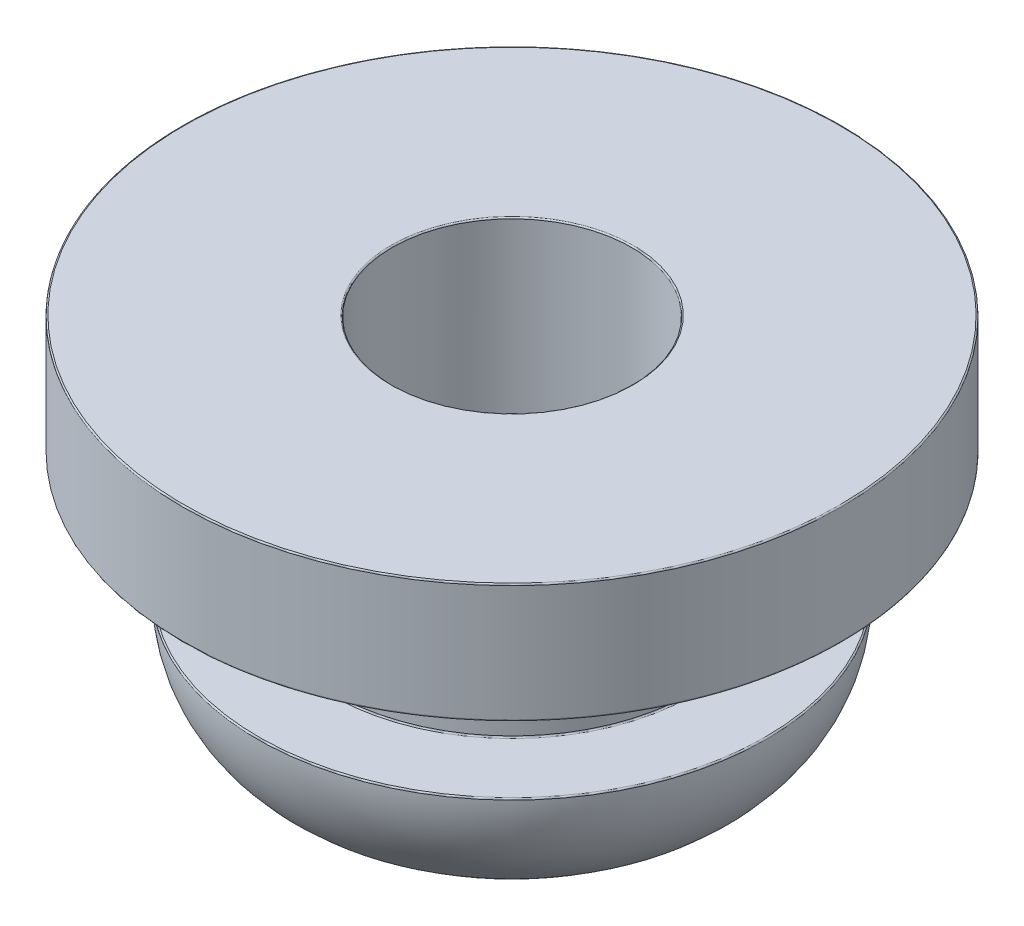
ISO-10303-21;
HEADER;
FILE_DESCRIPTION(('STEP AP214'),'2;1');
FILE_NAME('part.step','',(''),(''),'','','');
FILE_SCHEMA(('AUTOMOTIVE_DESIGN { 1 0 10303 214 1 1 1 1 }'));
ENDSEC;
DATA;
#1=APPLICATION_CONTEXT('core data for automotive mechanical design processes');
#2=APPLICATION_PROTOCOL_DEFINITION('international standard','automotive_design',2000,#1);
#3=PRODUCT_CONTEXT('',#1,'mechanical');
#4=PRODUCT('Part','Part','',(#3));
#5=PRODUCT_RELATED_PRODUCT_CATEGORY('part','',(#4));
#6=PRODUCT_DEFINITION_FORMATION('','',#4);
#7=PRODUCT_DEFINITION_CONTEXT('part definition',#1,'design');
#8=PRODUCT_DEFINITION('design','',#6,#7);
#9=PRODUCT_DEFINITION_SHAPE('','',#8);
#10=(LENGTH_UNIT() NAMED_UNIT(*) SI_UNIT(.MILLI.,.METRE.));
#11=(NAMED_UNIT(*) PLANE_ANGLE_UNIT() SI_UNIT($,.RADIAN.));
#12=(NAMED_UNIT(*) SI_UNIT($,.STERADIAN.) SOLID_ANGLE_UNIT());
#13=UNCERTAINTY_MEASURE_WITH_UNIT(LENGTH_MEASURE(1.E-05),#10,'distance_accuracy_value','');
#14=(GEOMETRIC_REPRESENTATION_CONTEXT(3) GLOBAL_UNCERTAINTY_ASSIGNED_CONTEXT((#13)) GLOBAL_UNIT_ASSIGNED_CONTEXT((#10,
#11,#12)) REPRESENTATION_CONTEXT('',''));
#15=CARTESIAN_POINT('',(0.,0.,0.));
#16=DIRECTION('',(0.,0.,1.));
#17=DIRECTION('',(1.,0.,0.));
#18=AXIS2_PLACEMENT_3D('',#15,#16,#17);
#19=CARTESIAN_POINT('',(2.38125,0.79375,0.));
#20=DIRECTION('',(0.,1.,0.));
#21=DIRECTION('',(-1.,0.,0.));
#22=AXIS2_PLACEMENT_3D('',#19,#20,#21);
#23=PLANE('',#22);
#24=CARTESIAN_POINT('',(0.,0.79375,0.));
#25=DIRECTION('',(0.,1.,0.));
#26=DIRECTION('',(-1.,0.,0.));
#27=AXIS2_PLACEMENT_3D('',#24,#25,#26);
#28=CIRCLE('',#27,4.3481625);
#29=CARTESIAN_POINT('',(-4.3481625,0.79375,0.));
#30=VERTEX_POINT('',#29);
#31=EDGE_CURVE('E76',#30,#30,#28,.F.);
#32=ORIENTED_EDGE('',*,*,#31,.T.);
#33=EDGE_LOOP('',(#32));
#34=FACE_BOUND('',#33,.T.);
#35=CARTESIAN_POINT('',(0.,0.79375,0.));
#36=DIRECTION('',(0.,1.,0.));
#37=DIRECTION('',(-1.,0.,0.));
#38=AXIS2_PLACEMENT_3D('',#35,#36,#37);
#39=CIRCLE('',#38,2.3987125);
#40=CARTESIAN_POINT('',(-2.3987125,0.79375,0.));
#41=VERTEX_POINT('',#40);
#42=EDGE_CURVE('E79',#41,#41,#39,.T.);
#43=ORIENTED_EDGE('',*,*,#42,.T.);
#44=EDGE_LOOP('',(#43));
#45=FACE_BOUND('',#44,.T.);
#46=ADVANCED_FACE('F32',(#34,#45),#23,.F.);
#47=CARTESIAN_POINT('',(0.,2.36855,0.));
#48=DIRECTION('',(0.,1.,0.));
#49=DIRECTION('',(-1.,0.,0.));
#50=AXIS2_PLACEMENT_3D('',#47,#48,#49);
#51=CYLINDRICAL_SURFACE('',#50,4.365625);
#52=CARTESIAN_POINT('',(0.,0.8112125,0.));
#53=DIRECTION('',(0.,1.,0.));
#54=DIRECTION('',(-1.,0.,0.));
#55=AXIS2_PLACEMENT_3D('',#52,#53,#54);
#56=CIRCLE('',#55,4.365625);
#57=CARTESIAN_POINT('',(-4.365625,0.8112125,0.));
#58=VERTEX_POINT('',#57);
#59=EDGE_CURVE('E82',#58,#58,#56,.T.);
#60=ORIENTED_EDGE('',*,*,#59,.T.);
#61=EDGE_LOOP('',(#60));
#62=FACE_BOUND('',#61,.T.);
#63=CARTESIAN_POINT('',(0.,2.3510875,0.));
#64=DIRECTION('',(0.,-1.,0.));
#65=DIRECTION('',(1.,0.,0.));
#66=AXIS2_PLACEMENT_3D('',#63,#64,#65);
#67=CIRCLE('',#66,4.365625);
#68=CARTESIAN_POINT('',(4.365625,2.3510875,0.));
#69=VERTEX_POINT('',#68);
#70=EDGE_CURVE('E85',#69,#69,#67,.T.);
#71=ORIENTED_EDGE('',*,*,#70,.T.);
#72=EDGE_LOOP('',(#71));
#73=FACE_BOUND('',#72,.T.);
#74=ADVANCED_FACE('F89',(#62,#73),#51,.T.);
#75=CARTESIAN_POINT('',(4.365625,2.36855,0.));
#76=DIRECTION('',(0.,-1.,0.));
#77=DIRECTION('',(1.,0.,0.));
#78=AXIS2_PLACEMENT_3D('',#75,#76,#77);
#79=PLANE('',#78);
#80=CARTESIAN_POINT('',(0.,2.36855,0.));
#81=DIRECTION('',(0.,-1.,0.));
#82=DIRECTION('',(1.,0.,0.));
#83=AXIS2_PLACEMENT_3D('',#80,#81,#82);
#84=CIRCLE('',#83,4.3481625);
#85=CARTESIAN_POINT('',(4.3481625,2.36855,0.));
#86=VERTEX_POINT('',#85);
#87=EDGE_CURVE('E10',#86,#86,#84,.F.);
#88=ORIENTED_EDGE('',*,*,#87,.T.);
#89=EDGE_LOOP('',(#88));
#90=FACE_BOUND('',#89,.T.);
#91=CARTESIAN_POINT('',(0.,2.36855,0.));
#92=DIRECTION('',(0.,-1.,0.));
#93=DIRECTION('',(1.,0.,0.));
#94=AXIS2_PLACEMENT_3D('',#91,#92,#93);
#95=CIRCLE('',#94,1.6049625);
#96=CARTESIAN_POINT('',(1.6049625,2.36855,0.));
#97=VERTEX_POINT('',#96);
#98=EDGE_CURVE('E39',#97,#97,#95,.T.);
#99=ORIENTED_EDGE('',*,*,#98,.T.);
#100=EDGE_LOOP('',(#99));
#101=FACE_BOUND('',#100,.T.);
#102=ADVANCED_FACE('F109',(#90,#101),#79,.F.);
#103=CARTESIAN_POINT('',(0.,2.36855,0.));
#104=DIRECTION('',(0.,1.,0.));
#105=DIRECTION('',(-1.,0.,0.));
#106=AXIS2_PLACEMENT_3D('',#103,#104,#105);
#107=CYLINDRICAL_SURFACE('',#106,1.5875);
#108=CARTESIAN_POINT('',(0.,-2.3764875,0.));
#109=DIRECTION('',(0.,1.,0.));
#110=DIRECTION('',(-1.,0.,0.));
#111=AXIS2_PLACEMENT_3D('',#108,#109,#110);
#112=CIRCLE('',#111,1.5875);
#113=CARTESIAN_POINT('',(-1.5875,-2.3764875,0.));
#114=VERTEX_POINT('',#113);
#115=EDGE_CURVE('E43',#114,#114,#112,.F.);
#116=ORIENTED_EDGE('',*,*,#115,.T.);
#117=EDGE_LOOP('',(#116));
#118=FACE_BOUND('',#117,.T.);
#119=CARTESIAN_POINT('',(0.,2.3510875,0.));
#120=DIRECTION('',(0.,-1.,0.));
#121=DIRECTION('',(1.,0.,0.));
#122=AXIS2_PLACEMENT_3D('',#119,#120,#121);
#123=CIRCLE('',#122,1.5875);
#124=CARTESIAN_POINT('',(1.5875,2.3510875,0.));
#125=VERTEX_POINT('',#124);
#126=EDGE_CURVE('E47',#125,#125,#123,.F.);
#127=ORIENTED_EDGE('',*,*,#126,.T.);
#128=EDGE_LOOP('',(#127));
#129=FACE_BOUND('',#128,.T.);
#130=ADVANCED_FACE('F152',(#118,#129),#107,.F.);
#131=CARTESIAN_POINT('',(1.5875,-2.39395,0.));
#132=DIRECTION('',(0.,1.,0.));
#133=DIRECTION('',(-1.,0.,0.));
#134=AXIS2_PLACEMENT_3D('',#131,#132,#133);
#135=PLANE('',#134);
#136=CARTESIAN_POINT('',(0.,-2.39395,0.));
#137=DIRECTION('',(0.,1.,0.));
#138=DIRECTION('',(-1.,0.,0.));
#139=AXIS2_PLACEMENT_3D('',#136,#137,#138);
#140=CIRCLE('',#139,2.37714377238563);
#141=CARTESIAN_POINT('',(-2.37714377238563,-2.39395,0.));
#142=VERTEX_POINT('',#141);
#143=EDGE_CURVE('E52',#142,#142,#140,.F.);
#144=ORIENTED_EDGE('',*,*,#143,.T.);
#145=EDGE_LOOP('',(#144));
#146=FACE_BOUND('',#145,.T.);
#147=CARTESIAN_POINT('',(0.,-2.39395,0.));
#148=DIRECTION('',(0.,1.,0.));
#149=DIRECTION('',(-1.,0.,0.));
#150=AXIS2_PLACEMENT_3D('',#147,#148,#149);
#151=CIRCLE('',#150,1.6049625);
#152=CARTESIAN_POINT('',(-1.6049625,-2.39395,0.));
#153=VERTEX_POINT('',#152);
#154=EDGE_CURVE('E55',#153,#153,#151,.T.);
#155=ORIENTED_EDGE('',*,*,#154,.T.);
#156=EDGE_LOOP('',(#155));
#157=FACE_BOUND('',#156,.T.);
#158=ADVANCED_FACE('F143',(#146,#157),#135,.F.);
#159=CARTESIAN_POINT('',(0.,-0.79375,0.));
#160=DIRECTION('',(0.,1.,0.));
#161=DIRECTION('',(-1.,0.,0.));
#162=AXIS2_PLACEMENT_3D('',#159,#160,#161);
#163=DEGENERATE_TOROIDAL_SURFACE('',#162,1.58694247,1.78649503,.T.);
#164=CARTESIAN_POINT('',(0.,-0.811384876087539,0.));
#165=DIRECTION('',(0.,1.,0.));
#166=DIRECTION('',(-1.,0.,0.));
#167=AXIS2_PLACEMENT_3D('',#164,#165,#166);
#168=CIRCLE('',#167,3.37335045905515);
#169=CARTESIAN_POINT('',(-3.37335045905515,-0.811384876087539,0.));
#170=VERTEX_POINT('',#169);
#171=EDGE_CURVE('E58',#170,#170,#168,.F.);
#172=ORIENTED_EDGE('',*,*,#171,.T.);
#173=EDGE_LOOP('',(#172));
#174=FACE_BOUND('',#173,.T.);
#175=CARTESIAN_POINT('',(0.,-2.39211104175236,0.));
#176=DIRECTION('',(0.,1.,0.));
#177=DIRECTION('',(-1.,0.,0.));
#178=AXIS2_PLACEMENT_3D('',#175,#176,#177);
#179=CIRCLE('',#178,2.38494401913571);
#180=CARTESIAN_POINT('',(-2.38494401913571,-2.39211104175236,0.));
#181=VERTEX_POINT('',#180);
#182=EDGE_CURVE('E61',#181,#181,#179,.T.);
#183=ORIENTED_EDGE('',*,*,#182,.T.);
#184=EDGE_LOOP('',(#183));
#185=FACE_BOUND('',#184,.T.);
#186=ADVANCED_FACE('F140',(#174,#185),#163,.T.);
#187=CARTESIAN_POINT('',(2.38125,-0.79375,0.));
#188=DIRECTION('',(0.,-1.,0.));
#189=DIRECTION('',(1.,0.,0.));
#190=AXIS2_PLACEMENT_3D('',#187,#188,#189);
#191=PLANE('',#190);
#192=CARTESIAN_POINT('',(0.,-0.79375,0.));
#193=DIRECTION('',(0.,-1.,0.));
#194=DIRECTION('',(1.,0.,0.));
#195=AXIS2_PLACEMENT_3D('',#192,#193,#194);
#196=CIRCLE('',#195,3.35588880985657);
#197=CARTESIAN_POINT('',(3.35588880985657,-0.79375,0.));
#198=VERTEX_POINT('',#197);
#199=EDGE_CURVE('E64',#198,#198,#196,.F.);
#200=ORIENTED_EDGE('',*,*,#199,.T.);
#201=EDGE_LOOP('',(#200));
#202=FACE_BOUND('',#201,.T.);
#203=CARTESIAN_POINT('',(0.,-0.79375,0.));
#204=DIRECTION('',(0.,-1.,0.));
#205=DIRECTION('',(1.,0.,0.));
#206=AXIS2_PLACEMENT_3D('',#203,#204,#205);
#207=CIRCLE('',#206,2.3987125);
#208=CARTESIAN_POINT('',(2.3987125,-0.79375,0.));
#209=VERTEX_POINT('',#208);
#210=EDGE_CURVE('E67',#209,#209,#207,.T.);
#211=ORIENTED_EDGE('',*,*,#210,.T.);
#212=EDGE_LOOP('',(#211));
#213=FACE_BOUND('',#212,.T.);
#214=ADVANCED_FACE('F142',(#202,#213),#191,.F.);
#215=CARTESIAN_POINT('',(0.,2.36855,0.));
#216=DIRECTION('',(0.,1.,0.));
#217=DIRECTION('',(-1.,0.,0.));
#218=AXIS2_PLACEMENT_3D('',#215,#216,#217);
#219=CYLINDRICAL_SURFACE('',#218,2.38125);
#220=CARTESIAN_POINT('',(0.,0.7762875,0.));
#221=DIRECTION('',(0.,1.,0.));
#222=DIRECTION('',(-1.,0.,0.));
#223=AXIS2_PLACEMENT_3D('',#220,#221,#222);
#224=CIRCLE('',#223,2.38125);
#225=CARTESIAN_POINT('',(-2.38125,0.7762875,0.));
#226=VERTEX_POINT('',#225);
#227=EDGE_CURVE('E70',#226,#226,#224,.F.);
#228=ORIENTED_EDGE('',*,*,#227,.T.);
#229=EDGE_LOOP('',(#228));
#230=FACE_BOUND('',#229,.T.);
#231=CARTESIAN_POINT('',(0.,-0.7762875,0.));
#232=DIRECTION('',(0.,-1.,0.));
#233=DIRECTION('',(1.,0.,0.));
#234=AXIS2_PLACEMENT_3D('',#231,#232,#233);
#235=CIRCLE('',#234,2.38125);
#236=CARTESIAN_POINT('',(2.38125,-0.7762875,0.));
#237=VERTEX_POINT('',#236);
#238=EDGE_CURVE('E73',#237,#237,#235,.F.);
#239=ORIENTED_EDGE('',*,*,#238,.T.);
#240=EDGE_LOOP('',(#239));
#241=FACE_BOUND('',#240,.T.);
#242=ADVANCED_FACE('F119',(#230,#241),#219,.T.);
#243=CARTESIAN_POINT('',(0.,0.8112125,0.));
#244=DIRECTION('',(0.,1.,0.));
#245=DIRECTION('',(-1.,0.,0.));
#246=AXIS2_PLACEMENT_3D('',#243,#244,#245);
#247=TOROIDAL_SURFACE('',#246,4.3481625,0.0174625);
#248=ORIENTED_EDGE('',*,*,#31,.F.);
#249=EDGE_LOOP('',(#248));
#250=FACE_BOUND('',#249,.T.);
#251=ORIENTED_EDGE('',*,*,#59,.F.);
#252=EDGE_LOOP('',(#251));
#253=FACE_BOUND('',#252,.T.);
#254=ADVANCED_FACE('F115',(#250,#253),#247,.T.);
#255=CARTESIAN_POINT('',(0.,0.7762875,0.));
#256=DIRECTION('',(0.,1.,0.));
#257=DIRECTION('',(-1.,0.,0.));
#258=AXIS2_PLACEMENT_3D('',#255,#256,#257);
#259=TOROIDAL_SURFACE('',#258,2.3987125,0.0174625);
#260=ORIENTED_EDGE('',*,*,#227,.F.);
#261=EDGE_LOOP('',(#260));
#262=FACE_BOUND('',#261,.T.);
#263=ORIENTED_EDGE('',*,*,#42,.F.);
#264=EDGE_LOOP('',(#263));
#265=FACE_BOUND('',#264,.T.);
#266=ADVANCED_FACE('F118',(#262,#265),#259,.F.);
#267=CARTESIAN_POINT('',(0.,-0.8112125,0.));
#268=DIRECTION('',(0.,-1.,0.));
#269=DIRECTION('',(1.,0.,0.));
#270=AXIS2_PLACEMENT_3D('',#267,#268,#269);
#271=TOROIDAL_SURFACE('',#270,3.35588880985657,0.0174625);
#272=ORIENTED_EDGE('',*,*,#171,.F.);
#273=EDGE_LOOP('',(#272));
#274=FACE_BOUND('',#273,.T.);
#275=ORIENTED_EDGE('',*,*,#199,.F.);
#276=EDGE_LOOP('',(#275));
#277=FACE_BOUND('',#276,.T.);
#278=ADVANCED_FACE('F123',(#274,#277),#271,.T.);
#279=CARTESIAN_POINT('',(0.,-0.7762875,0.));
#280=DIRECTION('',(0.,-1.,0.));
#281=DIRECTION('',(1.,0.,0.));
#282=AXIS2_PLACEMENT_3D('',#279,#280,#281);
#283=TOROIDAL_SURFACE('',#282,2.3987125,0.0174625);
#284=ORIENTED_EDGE('',*,*,#210,.F.);
#285=EDGE_LOOP('',(#284));
#286=FACE_BOUND('',#285,.T.);
#287=ORIENTED_EDGE('',*,*,#238,.F.);
#288=EDGE_LOOP('',(#287));
#289=FACE_BOUND('',#288,.T.);
#290=ADVANCED_FACE('F127',(#286,#289),#283,.F.);
#291=CARTESIAN_POINT('',(0.,-2.3764875,0.));
#292=DIRECTION('',(0.,1.,0.));
#293=DIRECTION('',(-1.,0.,0.));
#294=AXIS2_PLACEMENT_3D('',#291,#292,#293);
#295=TOROIDAL_SURFACE('',#294,2.37714377238563,0.0174625);
#296=ORIENTED_EDGE('',*,*,#143,.F.);
#297=EDGE_LOOP('',(#296));
#298=FACE_BOUND('',#297,.T.);
#299=ORIENTED_EDGE('',*,*,#182,.F.);
#300=EDGE_LOOP('',(#299));
#301=FACE_BOUND('',#300,.T.);
#302=ADVANCED_FACE('F100',(#298,#301),#295,.T.);
#303=CARTESIAN_POINT('',(0.,-2.3764875,0.));
#304=DIRECTION('',(0.,1.,0.));
#305=DIRECTION('',(-1.,0.,0.));
#306=AXIS2_PLACEMENT_3D('',#303,#304,#305);
#307=TOROIDAL_SURFACE('',#306,1.6049625,0.0174625);
#308=ORIENTED_EDGE('',*,*,#115,.F.);
#309=EDGE_LOOP('',(#308));
#310=FACE_BOUND('',#309,.T.);
#311=ORIENTED_EDGE('',*,*,#154,.F.);
#312=EDGE_LOOP('',(#311));
#313=FACE_BOUND('',#312,.T.);
#314=ADVANCED_FACE('F94',(#310,#313),#307,.T.);
#315=CARTESIAN_POINT('',(0.,2.3510875,0.));
#316=DIRECTION('',(0.,-1.,0.));
#317=DIRECTION('',(1.,0.,0.));
#318=AXIS2_PLACEMENT_3D('',#315,#316,#317);
#319=TOROIDAL_SURFACE('',#318,4.3481625,0.0174625);
#320=ORIENTED_EDGE('',*,*,#70,.F.);
#321=EDGE_LOOP('',(#320));
#322=FACE_BOUND('',#321,.T.);
#323=ORIENTED_EDGE('',*,*,#87,.F.);
#324=EDGE_LOOP('',(#323));
#325=FACE_BOUND('',#324,.T.);
#326=ADVANCED_FACE('F91',(#322,#325),#319,.T.);
#327=CARTESIAN_POINT('',(0.,2.3510875,0.));
#328=DIRECTION('',(0.,-1.,0.));
#329=DIRECTION('',(1.,0.,0.));
#330=AXIS2_PLACEMENT_3D('',#327,#328,#329);
#331=TOROIDAL_SURFACE('',#330,1.6049625,0.0174625);
#332=ORIENTED_EDGE('',*,*,#98,.F.);
#333=EDGE_LOOP('',(#332));
#334=FACE_BOUND('',#333,.T.);
#335=ORIENTED_EDGE('',*,*,#126,.F.);
#336=EDGE_LOOP('',(#335));
#337=FACE_BOUND('',#336,.T.);
#338=ADVANCED_FACE('F34',(#334,#337),#331,.T.);
#339=CLOSED_SHELL('',(#46,#74,#102,#130,#158,#186,#214,#242,#254,#266,#278,#290,#302,#314,#326,#338));
#340=MANIFOLD_SOLID_BREP('B2',#339);
#341=ADVANCED_BREP_SHAPE_REPRESENTATION('',(#18,#340),#14);
#342=SHAPE_DEFINITION_REPRESENTATION(#9,#341);
ENDSEC;
END-ISO-10303-21;
